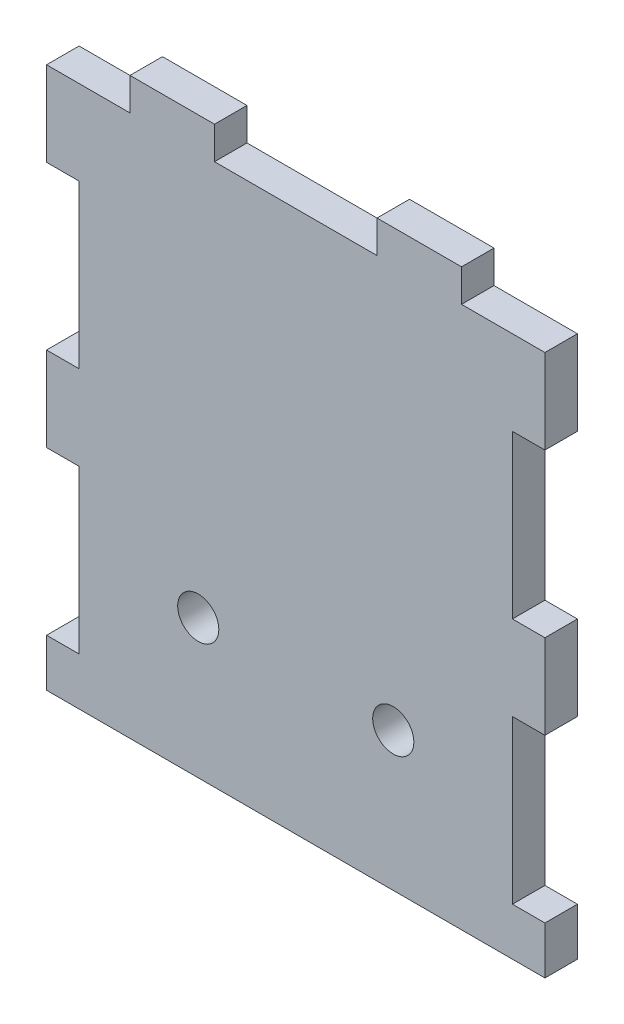
ISO-10303-21;
HEADER;
FILE_DESCRIPTION(('STEP AP214'),'2;1');
FILE_NAME('part.step','',(''),(''),'','','');
FILE_SCHEMA(('AUTOMOTIVE_DESIGN { 1 0 10303 214 1 1 1 1 }'));
ENDSEC;
DATA;
#1=APPLICATION_CONTEXT('core data for automotive mechanical design processes');
#2=APPLICATION_PROTOCOL_DEFINITION('international standard','automotive_design',2000,#1);
#3=PRODUCT_CONTEXT('',#1,'mechanical');
#4=PRODUCT('Part','Part','',(#3));
#5=PRODUCT_RELATED_PRODUCT_CATEGORY('part','',(#4));
#6=PRODUCT_DEFINITION_FORMATION('','',#4);
#7=PRODUCT_DEFINITION_CONTEXT('part definition',#1,'design');
#8=PRODUCT_DEFINITION('design','',#6,#7);
#9=PRODUCT_DEFINITION_SHAPE('','',#8);
#10=(LENGTH_UNIT() NAMED_UNIT(*) SI_UNIT(.MILLI.,.METRE.));
#11=(NAMED_UNIT(*) PLANE_ANGLE_UNIT() SI_UNIT($,.RADIAN.));
#12=(NAMED_UNIT(*) SI_UNIT($,.STERADIAN.) SOLID_ANGLE_UNIT());
#13=UNCERTAINTY_MEASURE_WITH_UNIT(LENGTH_MEASURE(1.E-05),#10,'distance_accuracy_value','');
#14=(GEOMETRIC_REPRESENTATION_CONTEXT(3) GLOBAL_UNCERTAINTY_ASSIGNED_CONTEXT((#13)) GLOBAL_UNIT_ASSIGNED_CONTEXT((#10,
#11,#12)) REPRESENTATION_CONTEXT('',''));
#15=CARTESIAN_POINT('',(0.,0.,0.));
#16=DIRECTION('',(0.,0.,1.));
#17=DIRECTION('',(1.,0.,0.));
#18=AXIS2_PLACEMENT_3D('',#15,#16,#17);
#19=CARTESIAN_POINT('',(-40.9934606481482,16.5420138888889,3.));
#20=DIRECTION('',(0.,-1.,0.));
#21=DIRECTION('',(0.,0.,-1.));
#22=AXIS2_PLACEMENT_3D('',#19,#20,#21);
#23=PLANE('',#22);
#24=DIRECTION('',(0.,0.,1.));
#25=VECTOR('',#24,1.);
#26=CARTESIAN_POINT('',(-10.4934606481481,16.5420138888889,0.));
#27=LINE('',#26,#25);
#28=CARTESIAN_POINT('',(-10.4934606481481,16.5420138888889,0.));
#29=VERTEX_POINT('',#28);
#30=CARTESIAN_POINT('',(-10.4934606481481,16.5420138888889,3.));
#31=VERTEX_POINT('',#30);
#32=EDGE_CURVE('E243',#29,#31,#27,.T.);
#33=ORIENTED_EDGE('',*,*,#32,.F.);
#34=DIRECTION('',(-1.,0.,0.));
#35=VECTOR('',#34,1.);
#36=CARTESIAN_POINT('',(-40.9934606481482,16.5420138888889,0.));
#37=LINE('',#36,#35);
#38=CARTESIAN_POINT('',(-25.4934606481481,16.5420138888889,0.));
#39=VERTEX_POINT('',#38);
#40=EDGE_CURVE('E412',#29,#39,#37,.T.);
#41=ORIENTED_EDGE('',*,*,#40,.T.);
#42=DIRECTION('',(0.,0.,-1.));
#43=VECTOR('',#42,1.);
#44=CARTESIAN_POINT('',(-25.4934606481481,16.5420138888889,0.));
#45=LINE('',#44,#43);
#46=CARTESIAN_POINT('',(-25.4934606481481,16.5420138888889,3.));
#47=VERTEX_POINT('',#46);
#48=EDGE_CURVE('E247',#47,#39,#45,.T.);
#49=ORIENTED_EDGE('',*,*,#48,.F.);
#50=DIRECTION('',(-1.,0.,0.));
#51=VECTOR('',#50,1.);
#52=CARTESIAN_POINT('',(-40.9934606481482,16.5420138888889,3.));
#53=LINE('',#52,#51);
#54=EDGE_CURVE('E49',#31,#47,#53,.T.);
#55=ORIENTED_EDGE('',*,*,#54,.F.);
#56=EDGE_LOOP('',(#33,#41,#49,#55));
#57=FACE_BOUND('',#56,.T.);
#58=ADVANCED_FACE('F34',(#57),#23,.F.);
#59=DIRECTION('',(0.,0.,-1.));
#60=VECTOR('',#59,1.);
#61=CARTESIAN_POINT('',(-2.69346064814815,16.5420138888889,0.));
#62=LINE('',#61,#60);
#63=CARTESIAN_POINT('',(-2.69346064814815,16.5420138888889,3.));
#64=VERTEX_POINT('',#63);
#65=CARTESIAN_POINT('',(-2.69346064814815,16.5420138888889,0.));
#66=VERTEX_POINT('',#65);
#67=EDGE_CURVE('E57',#64,#66,#62,.T.);
#68=ORIENTED_EDGE('',*,*,#67,.F.);
#69=CARTESIAN_POINT('',(5.00653935185185,16.5420138888889,3.));
#70=VERTEX_POINT('',#69);
#71=EDGE_CURVE('E395',#70,#64,#53,.T.);
#72=ORIENTED_EDGE('',*,*,#71,.F.);
#73=DIRECTION('',(0.,0.,-1.));
#74=VECTOR('',#73,1.);
#75=CARTESIAN_POINT('',(5.00653935185185,16.5420138888889,3.));
#76=LINE('',#75,#74);
#77=CARTESIAN_POINT('',(5.00653935185185,16.5420138888889,0.));
#78=VERTEX_POINT('',#77);
#79=EDGE_CURVE('E415',#70,#78,#76,.T.);
#80=ORIENTED_EDGE('',*,*,#79,.T.);
#81=EDGE_CURVE('E410',#78,#66,#37,.T.);
#82=ORIENTED_EDGE('',*,*,#81,.T.);
#83=EDGE_LOOP('',(#68,#72,#80,#82));
#84=FACE_BOUND('',#83,.T.);
#85=ADVANCED_FACE('F495',(#84),#23,.F.);
#86=DIRECTION('',(0.,0.,1.));
#87=VECTOR('',#86,1.);
#88=CARTESIAN_POINT('',(-33.2934606481481,16.5420138888889,0.));
#89=LINE('',#88,#87);
#90=CARTESIAN_POINT('',(-33.2934606481481,16.5420138888889,0.));
#91=VERTEX_POINT('',#90);
#92=CARTESIAN_POINT('',(-33.2934606481481,16.5420138888889,3.));
#93=VERTEX_POINT('',#92);
#94=EDGE_CURVE('E244',#91,#93,#89,.T.);
#95=ORIENTED_EDGE('',*,*,#94,.F.);
#96=CARTESIAN_POINT('',(-40.9934606481482,16.5420138888889,0.));
#97=VERTEX_POINT('',#96);
#98=EDGE_CURVE('E408',#91,#97,#37,.T.);
#99=ORIENTED_EDGE('',*,*,#98,.T.);
#100=DIRECTION('',(0.,0.,-1.));
#101=VECTOR('',#100,1.);
#102=CARTESIAN_POINT('',(-40.9934606481482,16.5420138888889,3.));
#103=LINE('',#102,#101);
#104=CARTESIAN_POINT('',(-40.9934606481482,16.5420138888889,3.));
#105=VERTEX_POINT('',#104);
#106=EDGE_CURVE('E397',#105,#97,#103,.T.);
#107=ORIENTED_EDGE('',*,*,#106,.F.);
#108=EDGE_CURVE('E393',#93,#105,#53,.T.);
#109=ORIENTED_EDGE('',*,*,#108,.F.);
#110=EDGE_LOOP('',(#95,#99,#107,#109));
#111=FACE_BOUND('',#110,.T.);
#112=ADVANCED_FACE('F468',(#111),#23,.F.);
#113=CARTESIAN_POINT('',(5.00653935185185,16.5420138888889,3.));
#114=DIRECTION('',(-1.,0.,0.));
#115=DIRECTION('',(0.,-1.,0.));
#116=AXIS2_PLACEMENT_3D('',#113,#114,#115);
#117=PLANE('',#116);
#118=DIRECTION('',(0.,1.,0.));
#119=VECTOR('',#118,1.);
#120=CARTESIAN_POINT('',(5.00653935185185,16.5420138888889,0.));
#121=LINE('',#120,#119);
#122=CARTESIAN_POINT('',(5.00653935185186,-33.4579861111111,0.));
#123=VERTEX_POINT('',#122);
#124=CARTESIAN_POINT('',(5.00653935185185,-29.0579861111111,0.));
#125=VERTEX_POINT('',#124);
#126=EDGE_CURVE('E405',#123,#125,#121,.T.);
#127=ORIENTED_EDGE('',*,*,#126,.T.);
#128=DIRECTION('',(0.,0.,1.));
#129=VECTOR('',#128,1.);
#130=CARTESIAN_POINT('',(5.00653935185185,-29.0579861111111,0.));
#131=LINE('',#130,#129);
#132=CARTESIAN_POINT('',(5.00653935185185,-29.0579861111111,3.));
#133=VERTEX_POINT('',#132);
#134=EDGE_CURVE('E294',#125,#133,#131,.T.);
#135=ORIENTED_EDGE('',*,*,#134,.T.);
#136=DIRECTION('',(0.,1.,0.));
#137=VECTOR('',#136,1.);
#138=CARTESIAN_POINT('',(5.00653935185185,16.5420138888889,3.));
#139=LINE('',#138,#137);
#140=CARTESIAN_POINT('',(5.00653935185186,-33.4579861111111,3.));
#141=VERTEX_POINT('',#140);
#142=EDGE_CURVE('E390',#141,#133,#139,.T.);
#143=ORIENTED_EDGE('',*,*,#142,.F.);
#144=DIRECTION('',(0.,0.,-1.));
#145=VECTOR('',#144,1.);
#146=CARTESIAN_POINT('',(5.00653935185186,-33.4579861111111,3.));
#147=LINE('',#146,#145);
#148=EDGE_CURVE('E42',#141,#123,#147,.T.);
#149=ORIENTED_EDGE('',*,*,#148,.T.);
#150=EDGE_LOOP('',(#127,#135,#143,#149));
#151=FACE_BOUND('',#150,.T.);
#152=ADVANCED_FACE('F422',(#151),#117,.F.);
#153=CARTESIAN_POINT('',(-40.9934606481482,16.5420138888889,3.));
#154=DIRECTION('',(1.,0.,0.));
#155=DIRECTION('',(0.,0.,-1.));
#156=AXIS2_PLACEMENT_3D('',#153,#154,#155);
#157=PLANE('',#156);
#158=DIRECTION('',(0.,-1.,0.));
#159=VECTOR('',#158,1.);
#160=CARTESIAN_POINT('',(-40.9934606481482,16.5420138888889,0.));
#161=LINE('',#160,#159);
#162=CARTESIAN_POINT('',(-40.9934606481481,-6.25798611111111,0.));
#163=VERTEX_POINT('',#162);
#164=CARTESIAN_POINT('',(-40.9934606481482,-14.0579861111111,0.));
#165=VERTEX_POINT('',#164);
#166=EDGE_CURVE('E402',#163,#165,#161,.T.);
#167=ORIENTED_EDGE('',*,*,#166,.T.);
#168=DIRECTION('',(0.,0.,1.));
#169=VECTOR('',#168,1.);
#170=CARTESIAN_POINT('',(-40.9934606481482,-14.0579861111111,0.));
#171=LINE('',#170,#169);
#172=CARTESIAN_POINT('',(-40.9934606481482,-14.0579861111111,3.));
#173=VERTEX_POINT('',#172);
#174=EDGE_CURVE('E320',#165,#173,#171,.T.);
#175=ORIENTED_EDGE('',*,*,#174,.T.);
#176=DIRECTION('',(0.,-1.,0.));
#177=VECTOR('',#176,1.);
#178=CARTESIAN_POINT('',(-40.9934606481482,16.5420138888889,3.));
#179=LINE('',#178,#177);
#180=CARTESIAN_POINT('',(-40.9934606481481,-6.25798611111111,3.));
#181=VERTEX_POINT('',#180);
#182=EDGE_CURVE('E386',#181,#173,#179,.T.);
#183=ORIENTED_EDGE('',*,*,#182,.F.);
#184=DIRECTION('',(0.,0.,1.));
#185=VECTOR('',#184,1.);
#186=CARTESIAN_POINT('',(-40.9934606481481,-6.25798611111111,0.));
#187=LINE('',#186,#185);
#188=EDGE_CURVE('E339',#163,#181,#187,.T.);
#189=ORIENTED_EDGE('',*,*,#188,.F.);
#190=EDGE_LOOP('',(#167,#175,#183,#189));
#191=FACE_BOUND('',#190,.T.);
#192=ADVANCED_FACE('F443',(#191),#157,.F.);
#193=CARTESIAN_POINT('',(-40.9934606481482,8.74201388888889,0.));
#194=VERTEX_POINT('',#193);
#195=EDGE_CURVE('E398',#97,#194,#161,.T.);
#196=ORIENTED_EDGE('',*,*,#195,.T.);
#197=DIRECTION('',(0.,0.,1.));
#198=VECTOR('',#197,1.);
#199=CARTESIAN_POINT('',(-40.9934606481482,8.74201388888889,0.));
#200=LINE('',#199,#198);
#201=CARTESIAN_POINT('',(-40.9934606481482,8.74201388888889,3.));
#202=VERTEX_POINT('',#201);
#203=EDGE_CURVE('E348',#194,#202,#200,.T.);
#204=ORIENTED_EDGE('',*,*,#203,.T.);
#205=EDGE_CURVE('E382',#105,#202,#179,.T.);
#206=ORIENTED_EDGE('',*,*,#205,.F.);
#207=ORIENTED_EDGE('',*,*,#106,.T.);
#208=EDGE_LOOP('',(#196,#204,#206,#207));
#209=FACE_BOUND('',#208,.T.);
#210=ADVANCED_FACE('F464',(#209),#157,.F.);
#211=CARTESIAN_POINT('',(5.00653935185185,-14.0579861111111,3.));
#212=VERTEX_POINT('',#211);
#213=CARTESIAN_POINT('',(5.00653935185186,-6.25798611111111,3.));
#214=VERTEX_POINT('',#213);
#215=EDGE_CURVE('E394',#212,#214,#139,.T.);
#216=ORIENTED_EDGE('',*,*,#215,.F.);
#217=DIRECTION('',(0.,0.,1.));
#218=VECTOR('',#217,1.);
#219=CARTESIAN_POINT('',(5.00653935185185,-14.0579861111111,0.));
#220=LINE('',#219,#218);
#221=CARTESIAN_POINT('',(5.00653935185185,-14.0579861111111,0.));
#222=VERTEX_POINT('',#221);
#223=EDGE_CURVE('E287',#222,#212,#220,.T.);
#224=ORIENTED_EDGE('',*,*,#223,.F.);
#225=CARTESIAN_POINT('',(5.00653935185186,-6.25798611111111,0.));
#226=VERTEX_POINT('',#225);
#227=EDGE_CURVE('E409',#222,#226,#121,.T.);
#228=ORIENTED_EDGE('',*,*,#227,.T.);
#229=DIRECTION('',(0.,0.,1.));
#230=VECTOR('',#229,1.);
#231=CARTESIAN_POINT('',(5.00653935185186,-6.25798611111111,0.));
#232=LINE('',#231,#230);
#233=EDGE_CURVE('E344',#226,#214,#232,.T.);
#234=ORIENTED_EDGE('',*,*,#233,.T.);
#235=EDGE_LOOP('',(#216,#224,#228,#234));
#236=FACE_BOUND('',#235,.T.);
#237=ADVANCED_FACE('F506',(#236),#117,.F.);
#238=CARTESIAN_POINT('',(-40.9934606481482,-29.0579861111111,3.));
#239=VERTEX_POINT('',#238);
#240=CARTESIAN_POINT('',(-40.9934606481482,-33.4579861111111,3.));
#241=VERTEX_POINT('',#240);
#242=EDGE_CURVE('E387',#239,#241,#179,.T.);
#243=ORIENTED_EDGE('',*,*,#242,.F.);
#244=DIRECTION('',(0.,0.,1.));
#245=VECTOR('',#244,1.);
#246=CARTESIAN_POINT('',(-40.9934606481482,-29.0579861111111,0.));
#247=LINE('',#246,#245);
#248=CARTESIAN_POINT('',(-40.9934606481482,-29.0579861111111,0.));
#249=VERTEX_POINT('',#248);
#250=EDGE_CURVE('E313',#249,#239,#247,.T.);
#251=ORIENTED_EDGE('',*,*,#250,.F.);
#252=CARTESIAN_POINT('',(-40.9934606481482,-33.4579861111111,0.));
#253=VERTEX_POINT('',#252);
#254=EDGE_CURVE('E351',#249,#253,#161,.T.);
#255=ORIENTED_EDGE('',*,*,#254,.T.);
#256=DIRECTION('',(0.,0.,-1.));
#257=VECTOR('',#256,1.);
#258=CARTESIAN_POINT('',(-40.9934606481482,-33.4579861111111,3.));
#259=LINE('',#258,#257);
#260=EDGE_CURVE('E11',#241,#253,#259,.T.);
#261=ORIENTED_EDGE('',*,*,#260,.F.);
#262=EDGE_LOOP('',(#243,#251,#255,#261));
#263=FACE_BOUND('',#262,.T.);
#264=ADVANCED_FACE('F36',(#263),#157,.F.);
#265=CARTESIAN_POINT('',(-40.9934606481482,-33.4579861111111,3.));
#266=DIRECTION('',(0.,1.,0.));
#267=DIRECTION('',(0.,0.,1.));
#268=AXIS2_PLACEMENT_3D('',#265,#266,#267);
#269=PLANE('',#268);
#270=DIRECTION('',(1.,0.,0.));
#271=VECTOR('',#270,1.);
#272=CARTESIAN_POINT('',(-40.9934606481482,-33.4579861111111,0.));
#273=LINE('',#272,#271);
#274=EDGE_CURVE('E401',#253,#123,#273,.T.);
#275=ORIENTED_EDGE('',*,*,#274,.T.);
#276=ORIENTED_EDGE('',*,*,#148,.F.);
#277=DIRECTION('',(1.,0.,0.));
#278=VECTOR('',#277,1.);
#279=CARTESIAN_POINT('',(-40.9934606481482,-33.4579861111111,3.));
#280=LINE('',#279,#278);
#281=EDGE_CURVE('E385',#241,#141,#280,.T.);
#282=ORIENTED_EDGE('',*,*,#281,.F.);
#283=ORIENTED_EDGE('',*,*,#260,.T.);
#284=EDGE_LOOP('',(#275,#276,#282,#283));
#285=FACE_BOUND('',#284,.T.);
#286=ADVANCED_FACE('F436',(#285),#269,.F.);
#287=CARTESIAN_POINT('',(5.00653935185186,8.74201388888887,3.));
#288=VERTEX_POINT('',#287);
#289=EDGE_CURVE('E389',#288,#70,#139,.T.);
#290=ORIENTED_EDGE('',*,*,#289,.F.);
#291=DIRECTION('',(0.,0.,1.));
#292=VECTOR('',#291,1.);
#293=CARTESIAN_POINT('',(5.00653935185186,8.74201388888887,0.));
#294=LINE('',#293,#292);
#295=CARTESIAN_POINT('',(5.00653935185186,8.74201388888887,0.));
#296=VERTEX_POINT('',#295);
#297=EDGE_CURVE('E367',#296,#288,#294,.T.);
#298=ORIENTED_EDGE('',*,*,#297,.F.);
#299=EDGE_CURVE('E404',#296,#78,#121,.T.);
#300=ORIENTED_EDGE('',*,*,#299,.T.);
#301=ORIENTED_EDGE('',*,*,#79,.F.);
#302=EDGE_LOOP('',(#290,#298,#300,#301));
#303=FACE_BOUND('',#302,.T.);
#304=ADVANCED_FACE('F507',(#303),#117,.F.);
#305=CARTESIAN_POINT('',(0.,0.,3.));
#306=DIRECTION('',(0.,0.,1.));
#307=DIRECTION('',(1.,0.,0.));
#308=AXIS2_PLACEMENT_3D('',#305,#306,#307);
#309=PLANE('',#308);
#310=CARTESIAN_POINT('',(-8.99346064815144,-20.6579861111107,3.));
#311=DIRECTION('',(0.,0.,1.));
#312=DIRECTION('',(1.,0.,0.));
#313=AXIS2_PLACEMENT_3D('',#310,#311,#312);
#314=CIRCLE('',#313,1.89864999999999);
#315=CARTESIAN_POINT('',(-7.09481064815145,-20.6579861111107,3.));
#316=VERTEX_POINT('',#315);
#317=EDGE_CURVE('E556',#316,#316,#314,.T.);
#318=ORIENTED_EDGE('',*,*,#317,.F.);
#319=EDGE_LOOP('',(#318));
#320=FACE_BOUND('',#319,.T.);
#321=CARTESIAN_POINT('',(-26.9934606481514,-20.6579861111109,3.));
#322=DIRECTION('',(0.,0.,1.));
#323=DIRECTION('',(1.,0.,0.));
#324=AXIS2_PLACEMENT_3D('',#321,#322,#323);
#325=CIRCLE('',#324,1.89864999999999);
#326=CARTESIAN_POINT('',(-25.0948106481515,-20.6579861111109,3.));
#327=VERTEX_POINT('',#326);
#328=EDGE_CURVE('E550',#327,#327,#325,.T.);
#329=ORIENTED_EDGE('',*,*,#328,.F.);
#330=EDGE_LOOP('',(#329));
#331=FACE_BOUND('',#330,.T.);
#332=DIRECTION('',(1.,0.,0.));
#333=VECTOR('',#332,1.);
#334=CARTESIAN_POINT('',(5.00653935185185,-29.0579861111111,3.));
#335=LINE('',#334,#333);
#336=CARTESIAN_POINT('',(2.00653935185185,-29.0579861111111,3.));
#337=VERTEX_POINT('',#336);
#338=EDGE_CURVE('E281',#337,#133,#335,.T.);
#339=ORIENTED_EDGE('',*,*,#338,.F.);
#340=DIRECTION('',(0.,-1.,0.));
#341=VECTOR('',#340,1.);
#342=CARTESIAN_POINT('',(2.00653935185185,-14.0579861111111,3.));
#343=LINE('',#342,#341);
#344=CARTESIAN_POINT('',(2.00653935185185,-14.0579861111111,3.));
#345=VERTEX_POINT('',#344);
#346=EDGE_CURVE('E290',#345,#337,#343,.T.);
#347=ORIENTED_EDGE('',*,*,#346,.F.);
#348=DIRECTION('',(-1.,0.,0.));
#349=VECTOR('',#348,1.);
#350=CARTESIAN_POINT('',(5.00653935185185,-14.0579861111111,3.));
#351=LINE('',#350,#349);
#352=EDGE_CURVE('E276',#212,#345,#351,.T.);
#353=ORIENTED_EDGE('',*,*,#352,.F.);
#354=ORIENTED_EDGE('',*,*,#215,.T.);
#355=DIRECTION('',(1.,0.,0.));
#356=VECTOR('',#355,1.);
#357=CARTESIAN_POINT('',(5.00653935185186,-6.25798611111111,3.));
#358=LINE('',#357,#356);
#359=CARTESIAN_POINT('',(2.00653935185186,-6.25798611111111,3.));
#360=VERTEX_POINT('',#359);
#361=EDGE_CURVE('E361',#360,#214,#358,.T.);
#362=ORIENTED_EDGE('',*,*,#361,.F.);
#363=DIRECTION('',(0.,-1.,0.));
#364=VECTOR('',#363,1.);
#365=CARTESIAN_POINT('',(2.00653935185186,8.74201388888887,3.));
#366=LINE('',#365,#364);
#367=CARTESIAN_POINT('',(2.00653935185186,8.74201388888887,3.));
#368=VERTEX_POINT('',#367);
#369=EDGE_CURVE('E370',#368,#360,#366,.T.);
#370=ORIENTED_EDGE('',*,*,#369,.F.);
#371=DIRECTION('',(-1.,0.,0.));
#372=VECTOR('',#371,1.);
#373=CARTESIAN_POINT('',(5.00653935185186,8.74201388888887,3.));
#374=LINE('',#373,#372);
#375=EDGE_CURVE('E323',#288,#368,#374,.T.);
#376=ORIENTED_EDGE('',*,*,#375,.F.);
#377=ORIENTED_EDGE('',*,*,#289,.T.);
#378=ORIENTED_EDGE('',*,*,#71,.T.);
#379=DIRECTION('',(0.,-1.,0.));
#380=VECTOR('',#379,1.);
#381=CARTESIAN_POINT('',(-2.69346064814815,19.5420138888889,3.00000000000001));
#382=LINE('',#381,#380);
#383=CARTESIAN_POINT('',(-2.69346064814815,19.5420138888889,3.00000000000001));
#384=VERTEX_POINT('',#383);
#385=EDGE_CURVE('E228',#384,#64,#382,.T.);
#386=ORIENTED_EDGE('',*,*,#385,.F.);
#387=DIRECTION('',(1.,0.,0.));
#388=VECTOR('',#387,1.);
#389=CARTESIAN_POINT('',(-10.4934606481481,19.5420138888889,3.));
#390=LINE('',#389,#388);
#391=CARTESIAN_POINT('',(-10.4934606481481,19.5420138888889,3.));
#392=VERTEX_POINT('',#391);
#393=EDGE_CURVE('E220',#392,#384,#390,.T.);
#394=ORIENTED_EDGE('',*,*,#393,.F.);
#395=DIRECTION('',(0.,-1.,0.));
#396=VECTOR('',#395,1.);
#397=CARTESIAN_POINT('',(-10.4934606481481,19.5420138888889,3.));
#398=LINE('',#397,#396);
#399=EDGE_CURVE('E225',#392,#31,#398,.T.);
#400=ORIENTED_EDGE('',*,*,#399,.T.);
#401=ORIENTED_EDGE('',*,*,#54,.T.);
#402=DIRECTION('',(0.,-1.,0.));
#403=VECTOR('',#402,1.);
#404=CARTESIAN_POINT('',(-25.4934606481481,19.5420138888889,3.00000000000001));
#405=LINE('',#404,#403);
#406=CARTESIAN_POINT('',(-25.4934606481481,19.5420138888889,3.00000000000001));
#407=VERTEX_POINT('',#406);
#408=EDGE_CURVE('E270',#407,#47,#405,.T.);
#409=ORIENTED_EDGE('',*,*,#408,.F.);
#410=DIRECTION('',(1.,0.,0.));
#411=VECTOR('',#410,1.);
#412=CARTESIAN_POINT('',(-33.2934606481481,19.5420138888889,3.));
#413=LINE('',#412,#411);
#414=CARTESIAN_POINT('',(-33.2934606481481,19.5420138888889,3.));
#415=VERTEX_POINT('',#414);
#416=EDGE_CURVE('E256',#415,#407,#413,.T.);
#417=ORIENTED_EDGE('',*,*,#416,.F.);
#418=DIRECTION('',(0.,-1.,0.));
#419=VECTOR('',#418,1.);
#420=CARTESIAN_POINT('',(-33.2934606481481,19.5420138888889,3.));
#421=LINE('',#420,#419);
#422=EDGE_CURVE('E273',#415,#93,#421,.T.);
#423=ORIENTED_EDGE('',*,*,#422,.T.);
#424=ORIENTED_EDGE('',*,*,#108,.T.);
#425=ORIENTED_EDGE('',*,*,#205,.T.);
#426=DIRECTION('',(-1.,0.,0.));
#427=VECTOR('',#426,1.);
#428=CARTESIAN_POINT('',(-40.9934606481482,8.74201388888889,3.));
#429=LINE('',#428,#427);
#430=CARTESIAN_POINT('',(-37.9934606481481,8.74201388888889,3.));
#431=VERTEX_POINT('',#430);
#432=EDGE_CURVE('E333',#431,#202,#429,.T.);
#433=ORIENTED_EDGE('',*,*,#432,.F.);
#434=DIRECTION('',(0.,1.,0.));
#435=VECTOR('',#434,1.);
#436=CARTESIAN_POINT('',(-37.9934606481481,8.74201388888889,3.));
#437=LINE('',#436,#435);
#438=CARTESIAN_POINT('',(-37.9934606481481,-6.25798611111111,3.));
#439=VERTEX_POINT('',#438);
#440=EDGE_CURVE('E343',#439,#431,#437,.T.);
#441=ORIENTED_EDGE('',*,*,#440,.F.);
#442=DIRECTION('',(1.,0.,0.));
#443=VECTOR('',#442,1.);
#444=CARTESIAN_POINT('',(-40.9934606481481,-6.25798611111111,3.));
#445=LINE('',#444,#443);
#446=EDGE_CURVE('E340',#181,#439,#445,.T.);
#447=ORIENTED_EDGE('',*,*,#446,.F.);
#448=ORIENTED_EDGE('',*,*,#182,.T.);
#449=DIRECTION('',(-1.,0.,0.));
#450=VECTOR('',#449,1.);
#451=CARTESIAN_POINT('',(-40.9934606481482,-14.0579861111111,3.));
#452=LINE('',#451,#450);
#453=CARTESIAN_POINT('',(-37.9934606481482,-14.0579861111111,3.));
#454=VERTEX_POINT('',#453);
#455=EDGE_CURVE('E307',#454,#173,#452,.T.);
#456=ORIENTED_EDGE('',*,*,#455,.F.);
#457=DIRECTION('',(0.,1.,0.));
#458=VECTOR('',#457,1.);
#459=CARTESIAN_POINT('',(-37.9934606481482,-14.0579861111111,3.));
#460=LINE('',#459,#458);
#461=CARTESIAN_POINT('',(-37.9934606481482,-29.0579861111111,3.));
#462=VERTEX_POINT('',#461);
#463=EDGE_CURVE('E316',#462,#454,#460,.T.);
#464=ORIENTED_EDGE('',*,*,#463,.F.);
#465=DIRECTION('',(1.,0.,0.));
#466=VECTOR('',#465,1.);
#467=CARTESIAN_POINT('',(-40.9934606481482,-29.0579861111111,3.));
#468=LINE('',#467,#466);
#469=EDGE_CURVE('E297',#239,#462,#468,.T.);
#470=ORIENTED_EDGE('',*,*,#469,.F.);
#471=ORIENTED_EDGE('',*,*,#242,.T.);
#472=ORIENTED_EDGE('',*,*,#281,.T.);
#473=ORIENTED_EDGE('',*,*,#142,.T.);
#474=EDGE_LOOP('',(#339,#347,#353,#354,#362,#370,#376,#377,#378,#386,#394,#400,#401,#409,#417,
#423,#424,#425,#433,#441,#447,#448,#456,#464,#470,#471,#472,#473));
#475=FACE_BOUND('',#474,.T.);
#476=ADVANCED_FACE('F223',(#320,#331,#475),#309,.T.);
#477=CARTESIAN_POINT('',(0.,0.,0.));
#478=DIRECTION('',(0.,0.,1.));
#479=DIRECTION('',(1.,0.,0.));
#480=AXIS2_PLACEMENT_3D('',#477,#478,#479);
#481=PLANE('',#480);
#482=CARTESIAN_POINT('',(-8.99346064815144,-20.6579861111107,0.));
#483=DIRECTION('',(0.,0.,1.));
#484=DIRECTION('',(1.,0.,0.));
#485=AXIS2_PLACEMENT_3D('',#482,#483,#484);
#486=CIRCLE('',#485,1.89864999999999);
#487=CARTESIAN_POINT('',(-7.09481064815145,-20.6579861111107,0.));
#488=VERTEX_POINT('',#487);
#489=EDGE_CURVE('E553',#488,#488,#486,.T.);
#490=ORIENTED_EDGE('',*,*,#489,.T.);
#491=EDGE_LOOP('',(#490));
#492=FACE_BOUND('',#491,.T.);
#493=CARTESIAN_POINT('',(-26.9934606481514,-20.6579861111109,0.));
#494=DIRECTION('',(0.,0.,1.));
#495=DIRECTION('',(1.,0.,0.));
#496=AXIS2_PLACEMENT_3D('',#493,#494,#495);
#497=CIRCLE('',#496,1.89864999999999);
#498=CARTESIAN_POINT('',(-25.0948106481515,-20.6579861111109,0.));
#499=VERTEX_POINT('',#498);
#500=EDGE_CURVE('E545',#499,#499,#497,.T.);
#501=ORIENTED_EDGE('',*,*,#500,.T.);
#502=EDGE_LOOP('',(#501));
#503=FACE_BOUND('',#502,.T.);
#504=DIRECTION('',(0.,-1.,0.));
#505=VECTOR('',#504,1.);
#506=CARTESIAN_POINT('',(2.00653935185185,-14.0579861111111,0.));
#507=LINE('',#506,#505);
#508=CARTESIAN_POINT('',(2.00653935185185,-14.0579861111111,0.));
#509=VERTEX_POINT('',#508);
#510=CARTESIAN_POINT('',(2.00653935185185,-29.0579861111111,0.));
#511=VERTEX_POINT('',#510);
#512=EDGE_CURVE('E280',#509,#511,#507,.T.);
#513=ORIENTED_EDGE('',*,*,#512,.T.);
#514=DIRECTION('',(1.,0.,0.));
#515=VECTOR('',#514,1.);
#516=CARTESIAN_POINT('',(5.00653935185185,-29.0579861111111,0.));
#517=LINE('',#516,#515);
#518=EDGE_CURVE('E284',#511,#125,#517,.T.);
#519=ORIENTED_EDGE('',*,*,#518,.T.);
#520=ORIENTED_EDGE('',*,*,#126,.F.);
#521=ORIENTED_EDGE('',*,*,#274,.F.);
#522=ORIENTED_EDGE('',*,*,#254,.F.);
#523=DIRECTION('',(1.,0.,0.));
#524=VECTOR('',#523,1.);
#525=CARTESIAN_POINT('',(-40.9934606481482,-29.0579861111111,0.));
#526=LINE('',#525,#524);
#527=CARTESIAN_POINT('',(-37.9934606481482,-29.0579861111111,0.));
#528=VERTEX_POINT('',#527);
#529=EDGE_CURVE('E303',#249,#528,#526,.T.);
#530=ORIENTED_EDGE('',*,*,#529,.T.);
#531=DIRECTION('',(0.,1.,0.));
#532=VECTOR('',#531,1.);
#533=CARTESIAN_POINT('',(-37.9934606481482,-14.0579861111111,0.));
#534=LINE('',#533,#532);
#535=CARTESIAN_POINT('',(-37.9934606481482,-14.0579861111111,0.));
#536=VERTEX_POINT('',#535);
#537=EDGE_CURVE('E306',#528,#536,#534,.T.);
#538=ORIENTED_EDGE('',*,*,#537,.T.);
#539=DIRECTION('',(-1.,0.,0.));
#540=VECTOR('',#539,1.);
#541=CARTESIAN_POINT('',(-40.9934606481482,-14.0579861111111,0.));
#542=LINE('',#541,#540);
#543=EDGE_CURVE('E310',#536,#165,#542,.T.);
#544=ORIENTED_EDGE('',*,*,#543,.T.);
#545=ORIENTED_EDGE('',*,*,#166,.F.);
#546=DIRECTION('',(1.,0.,0.));
#547=VECTOR('',#546,1.);
#548=CARTESIAN_POINT('',(-40.9934606481481,-6.25798611111111,0.));
#549=LINE('',#548,#547);
#550=CARTESIAN_POINT('',(-37.9934606481481,-6.25798611111111,0.));
#551=VERTEX_POINT('',#550);
#552=EDGE_CURVE('E329',#163,#551,#549,.T.);
#553=ORIENTED_EDGE('',*,*,#552,.T.);
#554=DIRECTION('',(0.,1.,0.));
#555=VECTOR('',#554,1.);
#556=CARTESIAN_POINT('',(-37.9934606481481,8.74201388888889,0.));
#557=LINE('',#556,#555);
#558=CARTESIAN_POINT('',(-37.9934606481481,8.74201388888889,0.));
#559=VERTEX_POINT('',#558);
#560=EDGE_CURVE('E332',#551,#559,#557,.T.);
#561=ORIENTED_EDGE('',*,*,#560,.T.);
#562=DIRECTION('',(-1.,0.,0.));
#563=VECTOR('',#562,1.);
#564=CARTESIAN_POINT('',(-40.9934606481482,8.74201388888889,0.));
#565=LINE('',#564,#563);
#566=EDGE_CURVE('E336',#559,#194,#565,.T.);
#567=ORIENTED_EDGE('',*,*,#566,.T.);
#568=ORIENTED_EDGE('',*,*,#195,.F.);
#569=ORIENTED_EDGE('',*,*,#98,.F.);
#570=DIRECTION('',(0.,-1.,0.));
#571=VECTOR('',#570,1.);
#572=CARTESIAN_POINT('',(-33.2934606481481,19.5420138888889,0.));
#573=LINE('',#572,#571);
#574=CARTESIAN_POINT('',(-33.2934606481481,19.5420138888889,0.));
#575=VERTEX_POINT('',#574);
#576=EDGE_CURVE('E261',#575,#91,#573,.T.);
#577=ORIENTED_EDGE('',*,*,#576,.F.);
#578=DIRECTION('',(-1.,0.,0.));
#579=VECTOR('',#578,1.);
#580=CARTESIAN_POINT('',(-33.2934606481481,19.5420138888889,0.));
#581=LINE('',#580,#579);
#582=CARTESIAN_POINT('',(-25.4934606481481,19.5420138888889,0.));
#583=VERTEX_POINT('',#582);
#584=EDGE_CURVE('E260',#583,#575,#581,.T.);
#585=ORIENTED_EDGE('',*,*,#584,.F.);
#586=DIRECTION('',(0.,-1.,0.));
#587=VECTOR('',#586,1.);
#588=CARTESIAN_POINT('',(-25.4934606481481,19.5420138888889,0.));
#589=LINE('',#588,#587);
#590=EDGE_CURVE('E267',#583,#39,#589,.T.);
#591=ORIENTED_EDGE('',*,*,#590,.T.);
#592=ORIENTED_EDGE('',*,*,#40,.F.);
#593=DIRECTION('',(0.,-1.,0.));
#594=VECTOR('',#593,1.);
#595=CARTESIAN_POINT('',(-10.4934606481481,19.5420138888889,0.));
#596=LINE('',#595,#594);
#597=CARTESIAN_POINT('',(-10.4934606481481,19.5420138888889,0.));
#598=VERTEX_POINT('',#597);
#599=EDGE_CURVE('E540',#598,#29,#596,.T.);
#600=ORIENTED_EDGE('',*,*,#599,.F.);
#601=DIRECTION('',(-1.,0.,0.));
#602=VECTOR('',#601,1.);
#603=CARTESIAN_POINT('',(-10.4934606481481,19.5420138888889,0.));
#604=LINE('',#603,#602);
#605=CARTESIAN_POINT('',(-2.69346064814815,19.5420138888889,0.));
#606=VERTEX_POINT('',#605);
#607=EDGE_CURVE('E237',#606,#598,#604,.T.);
#608=ORIENTED_EDGE('',*,*,#607,.F.);
#609=DIRECTION('',(0.,-1.,0.));
#610=VECTOR('',#609,1.);
#611=CARTESIAN_POINT('',(-2.69346064814815,19.5420138888889,0.));
#612=LINE('',#611,#610);
#613=EDGE_CURVE('E249',#606,#66,#612,.T.);
#614=ORIENTED_EDGE('',*,*,#613,.T.);
#615=ORIENTED_EDGE('',*,*,#81,.F.);
#616=ORIENTED_EDGE('',*,*,#299,.F.);
#617=DIRECTION('',(-1.,0.,0.));
#618=VECTOR('',#617,1.);
#619=CARTESIAN_POINT('',(5.00653935185186,8.74201388888887,0.));
#620=LINE('',#619,#618);
#621=CARTESIAN_POINT('',(2.00653935185186,8.74201388888887,0.));
#622=VERTEX_POINT('',#621);
#623=EDGE_CURVE('E357',#296,#622,#620,.T.);
#624=ORIENTED_EDGE('',*,*,#623,.T.);
#625=DIRECTION('',(0.,-1.,0.));
#626=VECTOR('',#625,1.);
#627=CARTESIAN_POINT('',(2.00653935185186,8.74201388888887,0.));
#628=LINE('',#627,#626);
#629=CARTESIAN_POINT('',(2.00653935185186,-6.25798611111111,0.));
#630=VERTEX_POINT('',#629);
#631=EDGE_CURVE('E360',#622,#630,#628,.T.);
#632=ORIENTED_EDGE('',*,*,#631,.T.);
#633=DIRECTION('',(1.,0.,0.));
#634=VECTOR('',#633,1.);
#635=CARTESIAN_POINT('',(5.00653935185186,-6.25798611111111,0.));
#636=LINE('',#635,#634);
#637=EDGE_CURVE('E364',#630,#226,#636,.T.);
#638=ORIENTED_EDGE('',*,*,#637,.T.);
#639=ORIENTED_EDGE('',*,*,#227,.F.);
#640=DIRECTION('',(-1.,0.,0.));
#641=VECTOR('',#640,1.);
#642=CARTESIAN_POINT('',(5.00653935185185,-14.0579861111111,0.));
#643=LINE('',#642,#641);
#644=EDGE_CURVE('E277',#222,#509,#643,.T.);
#645=ORIENTED_EDGE('',*,*,#644,.T.);
#646=EDGE_LOOP('',(#513,#519,#520,#521,#522,#530,#538,#544,#545,#553,#561,#567,#568,#569,#577,
#585,#591,#592,#600,#608,#614,#615,#616,#624,#632,#638,#639,#645));
#647=FACE_BOUND('',#646,.T.);
#648=ADVANCED_FACE('F427',(#492,#503,#647),#481,.F.);
#649=CARTESIAN_POINT('',(5.00653935185186,-6.25798611111111,0.));
#650=DIRECTION('',(0.,-1.,0.));
#651=DIRECTION('',(1.,0.,0.));
#652=AXIS2_PLACEMENT_3D('',#649,#650,#651);
#653=PLANE('',#652);
#654=ORIENTED_EDGE('',*,*,#361,.T.);
#655=ORIENTED_EDGE('',*,*,#233,.F.);
#656=ORIENTED_EDGE('',*,*,#637,.F.);
#657=DIRECTION('',(0.,0.,1.));
#658=VECTOR('',#657,1.);
#659=CARTESIAN_POINT('',(2.00653935185186,-6.25798611111111,0.));
#660=LINE('',#659,#658);
#661=EDGE_CURVE('E377',#630,#360,#660,.T.);
#662=ORIENTED_EDGE('',*,*,#661,.T.);
#663=EDGE_LOOP('',(#654,#655,#656,#662));
#664=FACE_BOUND('',#663,.T.);
#665=ADVANCED_FACE('F533',(#664),#653,.F.);
#666=CARTESIAN_POINT('',(2.00653935185186,8.74201388888887,0.));
#667=DIRECTION('',(-1.,0.,0.));
#668=DIRECTION('',(0.,0.,1.));
#669=AXIS2_PLACEMENT_3D('',#666,#667,#668);
#670=PLANE('',#669);
#671=ORIENTED_EDGE('',*,*,#369,.T.);
#672=ORIENTED_EDGE('',*,*,#661,.F.);
#673=ORIENTED_EDGE('',*,*,#631,.F.);
#674=DIRECTION('',(0.,0.,1.));
#675=VECTOR('',#674,1.);
#676=CARTESIAN_POINT('',(2.00653935185186,8.74201388888887,0.));
#677=LINE('',#676,#675);
#678=EDGE_CURVE('E379',#622,#368,#677,.T.);
#679=ORIENTED_EDGE('',*,*,#678,.T.);
#680=EDGE_LOOP('',(#671,#672,#673,#679));
#681=FACE_BOUND('',#680,.T.);
#682=ADVANCED_FACE('F635',(#681),#670,.F.);
#683=CARTESIAN_POINT('',(5.00653935185186,8.74201388888887,0.));
#684=DIRECTION('',(0.,1.,0.));
#685=DIRECTION('',(-1.,0.,0.));
#686=AXIS2_PLACEMENT_3D('',#683,#684,#685);
#687=PLANE('',#686);
#688=ORIENTED_EDGE('',*,*,#375,.T.);
#689=ORIENTED_EDGE('',*,*,#678,.F.);
#690=ORIENTED_EDGE('',*,*,#623,.F.);
#691=ORIENTED_EDGE('',*,*,#297,.T.);
#692=EDGE_LOOP('',(#688,#689,#690,#691));
#693=FACE_BOUND('',#692,.T.);
#694=ADVANCED_FACE('F642',(#693),#687,.F.);
#695=CARTESIAN_POINT('',(-40.9934606481482,8.74201388888889,0.));
#696=DIRECTION('',(0.,1.,0.));
#697=DIRECTION('',(0.,0.,1.));
#698=AXIS2_PLACEMENT_3D('',#695,#696,#697);
#699=PLANE('',#698);
#700=ORIENTED_EDGE('',*,*,#432,.T.);
#701=ORIENTED_EDGE('',*,*,#203,.F.);
#702=ORIENTED_EDGE('',*,*,#566,.F.);
#703=DIRECTION('',(0.,0.,1.));
#704=VECTOR('',#703,1.);
#705=CARTESIAN_POINT('',(-37.9934606481481,8.74201388888889,0.));
#706=LINE('',#705,#704);
#707=EDGE_CURVE('E352',#559,#431,#706,.T.);
#708=ORIENTED_EDGE('',*,*,#707,.T.);
#709=EDGE_LOOP('',(#700,#701,#702,#708));
#710=FACE_BOUND('',#709,.T.);
#711=ADVANCED_FACE('F650',(#710),#699,.F.);
#712=CARTESIAN_POINT('',(-37.9934606481481,8.74201388888889,0.));
#713=DIRECTION('',(1.,0.,0.));
#714=DIRECTION('',(0.,0.,-1.));
#715=AXIS2_PLACEMENT_3D('',#712,#713,#714);
#716=PLANE('',#715);
#717=ORIENTED_EDGE('',*,*,#440,.T.);
#718=ORIENTED_EDGE('',*,*,#707,.F.);
#719=ORIENTED_EDGE('',*,*,#560,.F.);
#720=DIRECTION('',(0.,0.,1.));
#721=VECTOR('',#720,1.);
#722=CARTESIAN_POINT('',(-37.9934606481481,-6.25798611111111,0.));
#723=LINE('',#722,#721);
#724=EDGE_CURVE('E354',#551,#439,#723,.T.);
#725=ORIENTED_EDGE('',*,*,#724,.T.);
#726=EDGE_LOOP('',(#717,#718,#719,#725));
#727=FACE_BOUND('',#726,.T.);
#728=ADVANCED_FACE('F458',(#727),#716,.F.);
#729=CARTESIAN_POINT('',(-40.9934606481481,-6.25798611111111,0.));
#730=DIRECTION('',(0.,-1.,0.));
#731=DIRECTION('',(1.,0.,0.));
#732=AXIS2_PLACEMENT_3D('',#729,#730,#731);
#733=PLANE('',#732);
#734=ORIENTED_EDGE('',*,*,#446,.T.);
#735=ORIENTED_EDGE('',*,*,#724,.F.);
#736=ORIENTED_EDGE('',*,*,#552,.F.);
#737=ORIENTED_EDGE('',*,*,#188,.T.);
#738=EDGE_LOOP('',(#734,#735,#736,#737));
#739=FACE_BOUND('',#738,.T.);
#740=ADVANCED_FACE('F456',(#739),#733,.F.);
#741=CARTESIAN_POINT('',(-40.9934606481482,-14.0579861111111,0.));
#742=DIRECTION('',(0.,1.,0.));
#743=DIRECTION('',(0.,0.,1.));
#744=AXIS2_PLACEMENT_3D('',#741,#742,#743);
#745=PLANE('',#744);
#746=ORIENTED_EDGE('',*,*,#455,.T.);
#747=ORIENTED_EDGE('',*,*,#174,.F.);
#748=ORIENTED_EDGE('',*,*,#543,.F.);
#749=DIRECTION('',(0.,0.,1.));
#750=VECTOR('',#749,1.);
#751=CARTESIAN_POINT('',(-37.9934606481482,-14.0579861111111,0.));
#752=LINE('',#751,#750);
#753=EDGE_CURVE('E324',#536,#454,#752,.T.);
#754=ORIENTED_EDGE('',*,*,#753,.T.);
#755=EDGE_LOOP('',(#746,#747,#748,#754));
#756=FACE_BOUND('',#755,.T.);
#757=ADVANCED_FACE('F448',(#756),#745,.F.);
#758=CARTESIAN_POINT('',(-37.9934606481482,-14.0579861111111,0.));
#759=DIRECTION('',(1.,0.,0.));
#760=DIRECTION('',(0.,0.,-1.));
#761=AXIS2_PLACEMENT_3D('',#758,#759,#760);
#762=PLANE('',#761);
#763=ORIENTED_EDGE('',*,*,#463,.T.);
#764=ORIENTED_EDGE('',*,*,#753,.F.);
#765=ORIENTED_EDGE('',*,*,#537,.F.);
#766=DIRECTION('',(0.,0.,1.));
#767=VECTOR('',#766,1.);
#768=CARTESIAN_POINT('',(-37.9934606481482,-29.0579861111111,0.));
#769=LINE('',#768,#767);
#770=EDGE_CURVE('E326',#528,#462,#769,.T.);
#771=ORIENTED_EDGE('',*,*,#770,.T.);
#772=EDGE_LOOP('',(#763,#764,#765,#771));
#773=FACE_BOUND('',#772,.T.);
#774=ADVANCED_FACE('F676',(#773),#762,.F.);
#775=CARTESIAN_POINT('',(-40.9934606481482,-29.0579861111111,0.));
#776=DIRECTION('',(0.,-1.,0.));
#777=DIRECTION('',(1.,0.,0.));
#778=AXIS2_PLACEMENT_3D('',#775,#776,#777);
#779=PLANE('',#778);
#780=ORIENTED_EDGE('',*,*,#469,.T.);
#781=ORIENTED_EDGE('',*,*,#770,.F.);
#782=ORIENTED_EDGE('',*,*,#529,.F.);
#783=ORIENTED_EDGE('',*,*,#250,.T.);
#784=EDGE_LOOP('',(#780,#781,#782,#783));
#785=FACE_BOUND('',#784,.T.);
#786=ADVANCED_FACE('F684',(#785),#779,.F.);
#787=CARTESIAN_POINT('',(5.00653935185185,-29.0579861111111,0.));
#788=DIRECTION('',(0.,-1.,0.));
#789=DIRECTION('',(1.,0.,0.));
#790=AXIS2_PLACEMENT_3D('',#787,#788,#789);
#791=PLANE('',#790);
#792=ORIENTED_EDGE('',*,*,#338,.T.);
#793=ORIENTED_EDGE('',*,*,#134,.F.);
#794=ORIENTED_EDGE('',*,*,#518,.F.);
#795=DIRECTION('',(0.,0.,1.));
#796=VECTOR('',#795,1.);
#797=CARTESIAN_POINT('',(2.00653935185185,-29.0579861111111,0.));
#798=LINE('',#797,#796);
#799=EDGE_CURVE('E298',#511,#337,#798,.T.);
#800=ORIENTED_EDGE('',*,*,#799,.T.);
#801=EDGE_LOOP('',(#792,#793,#794,#800));
#802=FACE_BOUND('',#801,.T.);
#803=ADVANCED_FACE('F431',(#802),#791,.F.);
#804=CARTESIAN_POINT('',(2.00653935185185,-14.0579861111111,0.));
#805=DIRECTION('',(-1.,0.,0.));
#806=DIRECTION('',(0.,0.,1.));
#807=AXIS2_PLACEMENT_3D('',#804,#805,#806);
#808=PLANE('',#807);
#809=ORIENTED_EDGE('',*,*,#346,.T.);
#810=ORIENTED_EDGE('',*,*,#799,.F.);
#811=ORIENTED_EDGE('',*,*,#512,.F.);
#812=DIRECTION('',(0.,0.,1.));
#813=VECTOR('',#812,1.);
#814=CARTESIAN_POINT('',(2.00653935185185,-14.0579861111111,0.));
#815=LINE('',#814,#813);
#816=EDGE_CURVE('E300',#509,#345,#815,.T.);
#817=ORIENTED_EDGE('',*,*,#816,.T.);
#818=EDGE_LOOP('',(#809,#810,#811,#817));
#819=FACE_BOUND('',#818,.T.);
#820=ADVANCED_FACE('F490',(#819),#808,.F.);
#821=CARTESIAN_POINT('',(5.00653935185185,-14.0579861111111,0.));
#822=DIRECTION('',(0.,1.,0.));
#823=DIRECTION('',(-1.,0.,0.));
#824=AXIS2_PLACEMENT_3D('',#821,#822,#823);
#825=PLANE('',#824);
#826=ORIENTED_EDGE('',*,*,#352,.T.);
#827=ORIENTED_EDGE('',*,*,#816,.F.);
#828=ORIENTED_EDGE('',*,*,#644,.F.);
#829=ORIENTED_EDGE('',*,*,#223,.T.);
#830=EDGE_LOOP('',(#826,#827,#828,#829));
#831=FACE_BOUND('',#830,.T.);
#832=ADVANCED_FACE('F483',(#831),#825,.F.);
#833=CARTESIAN_POINT('',(-33.2934606481481,19.5420138888889,0.));
#834=DIRECTION('',(1.,0.,0.));
#835=DIRECTION('',(0.,0.,-1.));
#836=AXIS2_PLACEMENT_3D('',#833,#834,#835);
#837=PLANE('',#836);
#838=ORIENTED_EDGE('',*,*,#94,.T.);
#839=ORIENTED_EDGE('',*,*,#422,.F.);
#840=DIRECTION('',(0.,0.,1.));
#841=VECTOR('',#840,1.);
#842=CARTESIAN_POINT('',(-33.2934606481481,19.5420138888889,0.));
#843=LINE('',#842,#841);
#844=EDGE_CURVE('E253',#575,#415,#843,.T.);
#845=ORIENTED_EDGE('',*,*,#844,.F.);
#846=ORIENTED_EDGE('',*,*,#576,.T.);
#847=EDGE_LOOP('',(#838,#839,#845,#846));
#848=FACE_BOUND('',#847,.T.);
#849=ADVANCED_FACE('F481',(#848),#837,.F.);
#850=CARTESIAN_POINT('',(-25.4934606481481,19.5420138888889,0.));
#851=DIRECTION('',(-1.,0.,0.));
#852=DIRECTION('',(0.,0.,1.));
#853=AXIS2_PLACEMENT_3D('',#850,#851,#852);
#854=PLANE('',#853);
#855=ORIENTED_EDGE('',*,*,#48,.T.);
#856=ORIENTED_EDGE('',*,*,#590,.F.);
#857=DIRECTION('',(0.,0.,-1.));
#858=VECTOR('',#857,1.);
#859=CARTESIAN_POINT('',(-25.4934606481481,19.5420138888889,0.));
#860=LINE('',#859,#858);
#861=EDGE_CURVE('E258',#407,#583,#860,.T.);
#862=ORIENTED_EDGE('',*,*,#861,.F.);
#863=ORIENTED_EDGE('',*,*,#408,.T.);
#864=EDGE_LOOP('',(#855,#856,#862,#863));
#865=FACE_BOUND('',#864,.T.);
#866=ADVANCED_FACE('F472',(#865),#854,.F.);
#867=CARTESIAN_POINT('',(0.,19.5420138888889,0.));
#868=DIRECTION('',(0.,1.,0.));
#869=DIRECTION('',(0.,0.,1.));
#870=AXIS2_PLACEMENT_3D('',#867,#868,#869);
#871=PLANE('',#870);
#872=ORIENTED_EDGE('',*,*,#844,.T.);
#873=ORIENTED_EDGE('',*,*,#416,.T.);
#874=ORIENTED_EDGE('',*,*,#861,.T.);
#875=ORIENTED_EDGE('',*,*,#584,.T.);
#876=EDGE_LOOP('',(#872,#873,#874,#875));
#877=FACE_BOUND('',#876,.T.);
#878=ADVANCED_FACE('F478',(#877),#871,.T.);
#879=CARTESIAN_POINT('',(-10.4934606481481,19.5420138888889,0.));
#880=DIRECTION('',(1.,0.,0.));
#881=DIRECTION('',(0.,0.,-1.));
#882=AXIS2_PLACEMENT_3D('',#879,#880,#881);
#883=PLANE('',#882);
#884=ORIENTED_EDGE('',*,*,#32,.T.);
#885=ORIENTED_EDGE('',*,*,#399,.F.);
#886=DIRECTION('',(0.,0.,1.));
#887=VECTOR('',#886,1.);
#888=CARTESIAN_POINT('',(-10.4934606481481,19.5420138888889,0.));
#889=LINE('',#888,#887);
#890=EDGE_CURVE('E232',#598,#392,#889,.T.);
#891=ORIENTED_EDGE('',*,*,#890,.F.);
#892=ORIENTED_EDGE('',*,*,#599,.T.);
#893=EDGE_LOOP('',(#884,#885,#891,#892));
#894=FACE_BOUND('',#893,.T.);
#895=ADVANCED_FACE('F242',(#894),#883,.F.);
#896=CARTESIAN_POINT('',(-2.69346064814815,19.5420138888889,0.));
#897=DIRECTION('',(-1.,0.,0.));
#898=DIRECTION('',(0.,0.,1.));
#899=AXIS2_PLACEMENT_3D('',#896,#897,#898);
#900=PLANE('',#899);
#901=ORIENTED_EDGE('',*,*,#67,.T.);
#902=ORIENTED_EDGE('',*,*,#613,.F.);
#903=DIRECTION('',(0.,0.,-1.));
#904=VECTOR('',#903,1.);
#905=CARTESIAN_POINT('',(-2.69346064814815,19.5420138888889,0.));
#906=LINE('',#905,#904);
#907=EDGE_CURVE('E231',#384,#606,#906,.T.);
#908=ORIENTED_EDGE('',*,*,#907,.F.);
#909=ORIENTED_EDGE('',*,*,#385,.T.);
#910=EDGE_LOOP('',(#901,#902,#908,#909));
#911=FACE_BOUND('',#910,.T.);
#912=ADVANCED_FACE('F574',(#911),#900,.F.);
#913=CARTESIAN_POINT('',(22.8,19.5420138888889,0.));
#914=DIRECTION('',(0.,1.,0.));
#915=DIRECTION('',(0.,0.,1.));
#916=AXIS2_PLACEMENT_3D('',#913,#914,#915);
#917=PLANE('',#916);
#918=ORIENTED_EDGE('',*,*,#890,.T.);
#919=ORIENTED_EDGE('',*,*,#393,.T.);
#920=ORIENTED_EDGE('',*,*,#907,.T.);
#921=ORIENTED_EDGE('',*,*,#607,.T.);
#922=EDGE_LOOP('',(#918,#919,#920,#921));
#923=FACE_BOUND('',#922,.T.);
#924=ADVANCED_FACE('F235',(#923),#917,.T.);
#925=CARTESIAN_POINT('',(-26.9934606481514,-20.6579861111109,3.));
#926=DIRECTION('',(0.,0.,1.));
#927=DIRECTION('',(1.,0.,0.));
#928=AXIS2_PLACEMENT_3D('',#925,#926,#927);
#929=CYLINDRICAL_SURFACE('',#928,1.89864999999999);
#930=ORIENTED_EDGE('',*,*,#500,.F.);
#931=EDGE_LOOP('',(#930));
#932=FACE_BOUND('',#931,.T.);
#933=ORIENTED_EDGE('',*,*,#328,.T.);
#934=EDGE_LOOP('',(#933));
#935=FACE_BOUND('',#934,.T.);
#936=ADVANCED_FACE('F564',(#932,#935),#929,.F.);
#937=CARTESIAN_POINT('',(-8.99346064815144,-20.6579861111107,3.));
#938=DIRECTION('',(0.,0.,1.));
#939=DIRECTION('',(1.,0.,0.));
#940=AXIS2_PLACEMENT_3D('',#937,#938,#939);
#941=CYLINDRICAL_SURFACE('',#940,1.89864999999999);
#942=ORIENTED_EDGE('',*,*,#489,.F.);
#943=EDGE_LOOP('',(#942));
#944=FACE_BOUND('',#943,.T.);
#945=ORIENTED_EDGE('',*,*,#317,.T.);
#946=EDGE_LOOP('',(#945));
#947=FACE_BOUND('',#946,.T.);
#948=ADVANCED_FACE('F560',(#944,#947),#941,.F.);
#949=CLOSED_SHELL('',(#58,#85,#112,#152,#192,#210,#237,#264,#286,#304,#476,#648,#665,#682,#694,
#711,#728,#740,#757,#774,#786,#803,#820,#832,#849,#866,#878,#895,#912,#924,#936,#948));
#950=MANIFOLD_SOLID_BREP('B2',#949);
#951=ADVANCED_BREP_SHAPE_REPRESENTATION('',(#18,#950),#14);
#952=SHAPE_DEFINITION_REPRESENTATION(#9,#951);
ENDSEC;
END-ISO-10303-21;
